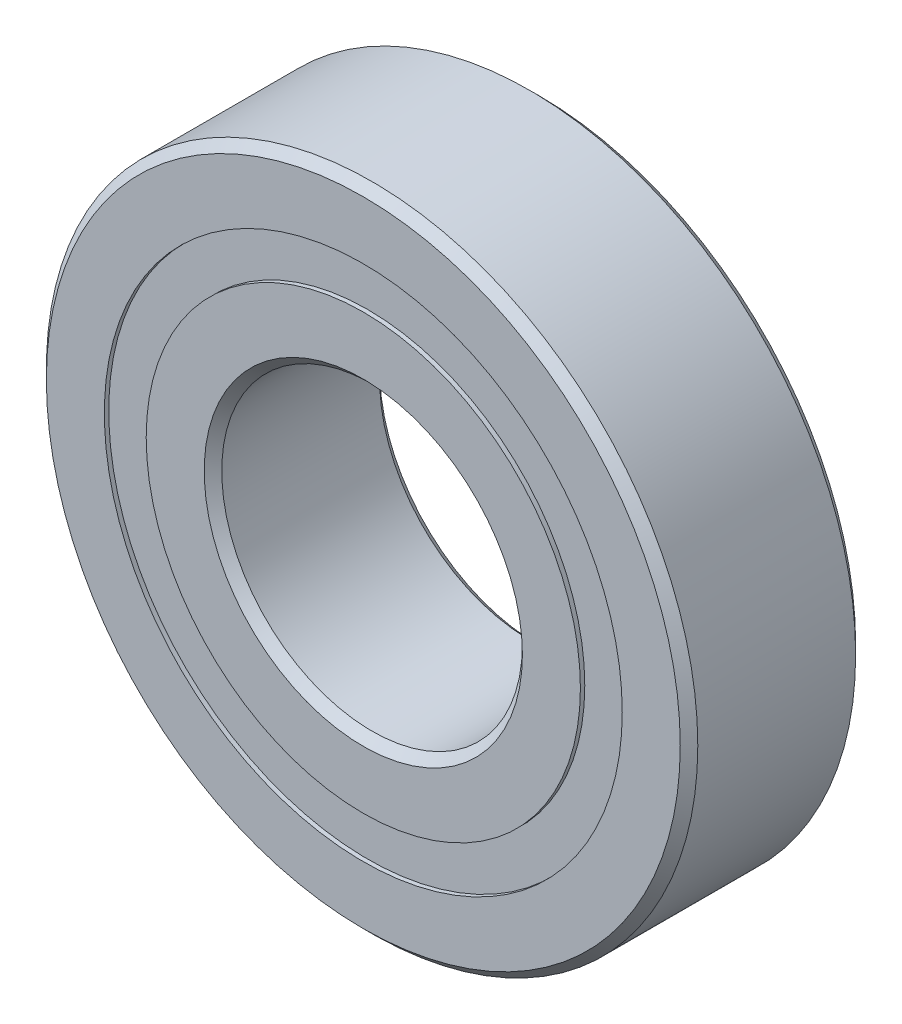
ISO-10303-21;
HEADER;
FILE_DESCRIPTION(('STEP AP214'),'2;1');
FILE_NAME('part.step','',(''),(''),'','','');
FILE_SCHEMA(('AUTOMOTIVE_DESIGN { 1 0 10303 214 1 1 1 1 }'));
ENDSEC;
DATA;
#1=APPLICATION_CONTEXT('core data for automotive mechanical design processes');
#2=APPLICATION_PROTOCOL_DEFINITION('international standard','automotive_design',2000,#1);
#3=PRODUCT_CONTEXT('',#1,'mechanical');
#4=PRODUCT('Part','Part','',(#3));
#5=PRODUCT_RELATED_PRODUCT_CATEGORY('part','',(#4));
#6=PRODUCT_DEFINITION_FORMATION('','',#4);
#7=PRODUCT_DEFINITION_CONTEXT('part definition',#1,'design');
#8=PRODUCT_DEFINITION('design','',#6,#7);
#9=PRODUCT_DEFINITION_SHAPE('','',#8);
#10=(LENGTH_UNIT() NAMED_UNIT(*) SI_UNIT(.MILLI.,.METRE.));
#11=(NAMED_UNIT(*) PLANE_ANGLE_UNIT() SI_UNIT($,.RADIAN.));
#12=(NAMED_UNIT(*) SI_UNIT($,.STERADIAN.) SOLID_ANGLE_UNIT());
#13=UNCERTAINTY_MEASURE_WITH_UNIT(LENGTH_MEASURE(1.E-05),#10,'distance_accuracy_value','');
#14=(GEOMETRIC_REPRESENTATION_CONTEXT(3) GLOBAL_UNCERTAINTY_ASSIGNED_CONTEXT((#13)) GLOBAL_UNIT_ASSIGNED_CONTEXT((#10,
#11,#12)) REPRESENTATION_CONTEXT('',''));
#15=CARTESIAN_POINT('',(0.,0.,0.));
#16=DIRECTION('',(0.,0.,1.));
#17=DIRECTION('',(1.,0.,0.));
#18=AXIS2_PLACEMENT_3D('',#15,#16,#17);
#19=CARTESIAN_POINT('',(0.,16.4070741758242,-5.2784375));
#20=DIRECTION('',(0.,0.,1.));
#21=DIRECTION('',(1.,0.,0.));
#22=AXIS2_PLACEMENT_3D('',#19,#20,#21);
#23=PLANE('',#22);
#24=CARTESIAN_POINT('',(0.,0.,-5.2784375));
#25=DIRECTION('',(0.,0.,1.));
#26=DIRECTION('',(1.,0.,0.));
#27=AXIS2_PLACEMENT_3D('',#24,#25,#26);
#28=CIRCLE('',#27,16.4070741758242);
#29=CARTESIAN_POINT('',(16.4070741758242,0.,-5.2784375));
#30=VERTEX_POINT('',#29);
#31=EDGE_CURVE('E55',#30,#30,#28,.T.);
#32=ORIENTED_EDGE('',*,*,#31,.F.);
#33=EDGE_LOOP('',(#32));
#34=FACE_BOUND('',#33,.T.);
#35=CARTESIAN_POINT('',(0.,0.,-5.2784375));
#36=DIRECTION('',(0.,0.,1.));
#37=DIRECTION('',(1.,0.,0.));
#38=AXIS2_PLACEMENT_3D('',#35,#36,#37);
#39=CIRCLE('',#38,13.7554258241758);
#40=CARTESIAN_POINT('',(13.7554258241758,0.,-5.2784375));
#41=VERTEX_POINT('',#40);
#42=EDGE_CURVE('E11',#41,#41,#39,.T.);
#43=ORIENTED_EDGE('',*,*,#42,.T.);
#44=EDGE_LOOP('',(#43));
#45=FACE_BOUND('',#44,.T.);
#46=ADVANCED_FACE('F41',(#34,#45),#23,.F.);
#47=CARTESIAN_POINT('',(0.,0.,5.55625));
#48=DIRECTION('',(0.,0.,1.));
#49=DIRECTION('',(1.,0.,0.));
#50=AXIS2_PLACEMENT_3D('',#47,#48,#49);
#51=CYLINDRICAL_SURFACE('',#50,13.7554258241758);
#52=ORIENTED_EDGE('',*,*,#42,.F.);
#53=EDGE_LOOP('',(#52));
#54=FACE_BOUND('',#53,.T.);
#55=CARTESIAN_POINT('',(0.,0.,-2.80284955168796));
#56=DIRECTION('',(0.,0.,1.));
#57=DIRECTION('',(1.,0.,0.));
#58=AXIS2_PLACEMENT_3D('',#55,#56,#57);
#59=CIRCLE('',#58,13.7554258241758);
#60=CARTESIAN_POINT('',(13.7554258241758,0.,-2.80284955168796));
#61=VERTEX_POINT('',#60);
#62=EDGE_CURVE('E47',#61,#61,#59,.T.);
#63=ORIENTED_EDGE('',*,*,#62,.T.);
#64=EDGE_LOOP('',(#63));
#65=FACE_BOUND('',#64,.T.);
#66=ADVANCED_FACE('F64',(#54,#65),#51,.F.);
#67=CARTESIAN_POINT('',(0.,16.4070741758242,-2.80284955168796));
#68=DIRECTION('',(0.,0.,-1.));
#69=DIRECTION('',(-1.,0.,0.));
#70=AXIS2_PLACEMENT_3D('',#67,#68,#69);
#71=PLANE('',#70);
#72=ORIENTED_EDGE('',*,*,#62,.F.);
#73=EDGE_LOOP('',(#72));
#74=FACE_BOUND('',#73,.T.);
#75=CARTESIAN_POINT('',(0.,0.,-2.80284955168796));
#76=DIRECTION('',(0.,0.,1.));
#77=DIRECTION('',(1.,0.,0.));
#78=AXIS2_PLACEMENT_3D('',#75,#76,#77);
#79=CIRCLE('',#78,16.4070741758242);
#80=CARTESIAN_POINT('',(16.4070741758242,0.,-2.80284955168796));
#81=VERTEX_POINT('',#80);
#82=EDGE_CURVE('E51',#81,#81,#79,.T.);
#83=ORIENTED_EDGE('',*,*,#82,.T.);
#84=EDGE_LOOP('',(#83));
#85=FACE_BOUND('',#84,.T.);
#86=ADVANCED_FACE('F68',(#74,#85),#71,.F.);
#87=CARTESIAN_POINT('',(0.,0.,5.55625));
#88=DIRECTION('',(0.,0.,1.));
#89=DIRECTION('',(1.,0.,0.));
#90=AXIS2_PLACEMENT_3D('',#87,#88,#89);
#91=CYLINDRICAL_SURFACE('',#90,16.4070741758242);
#92=ORIENTED_EDGE('',*,*,#82,.F.);
#93=EDGE_LOOP('',(#92));
#94=FACE_BOUND('',#93,.T.);
#95=ORIENTED_EDGE('',*,*,#31,.T.);
#96=EDGE_LOOP('',(#95));
#97=FACE_BOUND('',#96,.T.);
#98=ADVANCED_FACE('F61',(#94,#97),#91,.T.);
#99=CLOSED_SHELL('',(#46,#66,#86,#98));
#100=MANIFOLD_SOLID_BREP('B2',#99);
#101=CARTESIAN_POINT('',(0.,16.4070741758242,5.2784375));
#102=DIRECTION('',(0.,0.,-1.));
#103=DIRECTION('',(-1.,0.,0.));
#104=AXIS2_PLACEMENT_3D('',#101,#102,#103);
#105=PLANE('',#104);
#106=CARTESIAN_POINT('',(0.,0.,5.2784375));
#107=DIRECTION('',(0.,0.,1.));
#108=DIRECTION('',(1.,0.,0.));
#109=AXIS2_PLACEMENT_3D('',#106,#107,#108);
#110=CIRCLE('',#109,13.7554258241758);
#111=CARTESIAN_POINT('',(13.7554258241758,0.,5.2784375));
#112=VERTEX_POINT('',#111);
#113=EDGE_CURVE('E40',#112,#112,#110,.T.);
#114=ORIENTED_EDGE('',*,*,#113,.F.);
#115=EDGE_LOOP('',(#114));
#116=FACE_BOUND('',#115,.T.);
#117=CARTESIAN_POINT('',(0.,0.,5.2784375));
#118=DIRECTION('',(0.,0.,1.));
#119=DIRECTION('',(1.,0.,0.));
#120=AXIS2_PLACEMENT_3D('',#117,#118,#119);
#121=CIRCLE('',#120,16.4070741758242);
#122=CARTESIAN_POINT('',(16.4070741758242,0.,5.2784375));
#123=VERTEX_POINT('',#122);
#124=EDGE_CURVE('E122',#123,#123,#121,.T.);
#125=ORIENTED_EDGE('',*,*,#124,.T.);
#126=EDGE_LOOP('',(#125));
#127=FACE_BOUND('',#126,.T.);
#128=ADVANCED_FACE('F108',(#116,#127),#105,.F.);
#129=CARTESIAN_POINT('',(0.,0.,5.55625));
#130=DIRECTION('',(0.,0.,1.));
#131=DIRECTION('',(1.,0.,0.));
#132=AXIS2_PLACEMENT_3D('',#129,#130,#131);
#133=CYLINDRICAL_SURFACE('',#132,13.7554258241758);
#134=CARTESIAN_POINT('',(0.,0.,2.80284955168796));
#135=DIRECTION('',(0.,0.,1.));
#136=DIRECTION('',(1.,0.,0.));
#137=AXIS2_PLACEMENT_3D('',#134,#135,#136);
#138=CIRCLE('',#137,13.7554258241758);
#139=CARTESIAN_POINT('',(13.7554258241758,0.,2.80284955168796));
#140=VERTEX_POINT('',#139);
#141=EDGE_CURVE('E114',#140,#140,#138,.T.);
#142=ORIENTED_EDGE('',*,*,#141,.F.);
#143=EDGE_LOOP('',(#142));
#144=FACE_BOUND('',#143,.T.);
#145=ORIENTED_EDGE('',*,*,#113,.T.);
#146=EDGE_LOOP('',(#145));
#147=FACE_BOUND('',#146,.T.);
#148=ADVANCED_FACE('F137',(#144,#147),#133,.F.);
#149=CARTESIAN_POINT('',(0.,16.4070741758242,2.80284955168796));
#150=DIRECTION('',(0.,0.,1.));
#151=DIRECTION('',(1.,0.,0.));
#152=AXIS2_PLACEMENT_3D('',#149,#150,#151);
#153=PLANE('',#152);
#154=CARTESIAN_POINT('',(0.,0.,2.80284955168796));
#155=DIRECTION('',(0.,0.,1.));
#156=DIRECTION('',(1.,0.,0.));
#157=AXIS2_PLACEMENT_3D('',#154,#155,#156);
#158=CIRCLE('',#157,16.4070741758242);
#159=CARTESIAN_POINT('',(16.4070741758242,0.,2.80284955168796));
#160=VERTEX_POINT('',#159);
#161=EDGE_CURVE('E118',#160,#160,#158,.T.);
#162=ORIENTED_EDGE('',*,*,#161,.F.);
#163=EDGE_LOOP('',(#162));
#164=FACE_BOUND('',#163,.T.);
#165=ORIENTED_EDGE('',*,*,#141,.T.);
#166=EDGE_LOOP('',(#165));
#167=FACE_BOUND('',#166,.T.);
#168=ADVANCED_FACE('F132',(#164,#167),#153,.F.);
#169=CARTESIAN_POINT('',(0.,0.,5.55625));
#170=DIRECTION('',(0.,0.,1.));
#171=DIRECTION('',(1.,0.,0.));
#172=AXIS2_PLACEMENT_3D('',#169,#170,#171);
#173=CYLINDRICAL_SURFACE('',#172,16.4070741758242);
#174=ORIENTED_EDGE('',*,*,#124,.F.);
#175=EDGE_LOOP('',(#174));
#176=FACE_BOUND('',#175,.T.);
#177=ORIENTED_EDGE('',*,*,#161,.T.);
#178=EDGE_LOOP('',(#177));
#179=FACE_BOUND('',#178,.T.);
#180=ADVANCED_FACE('F129',(#176,#179),#173,.T.);
#181=CLOSED_SHELL('',(#128,#148,#168,#180));
#182=MANIFOLD_SOLID_BREP('B6',#181);
#183=CARTESIAN_POINT('',(-7.54062499999983,13.0607456208242,0.));
#184=DIRECTION('',(0.,0.,1.));
#185=DIRECTION('',(-0.499999999999989,0.866025403784445,0.));
#186=AXIS2_PLACEMENT_3D('',#183,#184,#185);
#187=SPHERICAL_SURFACE('',#186,2.80284955168796);
#188=CARTESIAN_POINT('',(-7.54062499999983,13.0607456208242,2.80284955168796));
#189=VERTEX_POINT('',#188);
#190=VERTEX_LOOP('',#189);
#191=FACE_BOUND('',#190,.T.);
#192=ADVANCED_FACE('F175',(#191),#187,.T.);
#193=CLOSED_SHELL('',(#192));
#194=MANIFOLD_SOLID_BREP('B35',#193);
#195=CARTESIAN_POINT('',(-13.060745620824,7.54062500000015,0.));
#196=DIRECTION('',(0.,0.,1.));
#197=DIRECTION('',(-0.866025403784433,0.50000000000001,0.));
#198=AXIS2_PLACEMENT_3D('',#195,#196,#197);
#199=SPHERICAL_SURFACE('',#198,2.80284955168796);
#200=CARTESIAN_POINT('',(-13.060745620824,7.54062500000015,2.80284955168796));
#201=VERTEX_POINT('',#200);
#202=VERTEX_LOOP('',#201);
#203=FACE_BOUND('',#202,.T.);
#204=ADVANCED_FACE('F195',(#203),#199,.T.);
#205=CLOSED_SHELL('',(#204));
#206=MANIFOLD_SOLID_BREP('B104',#205);
#207=CARTESIAN_POINT('',(-15.08125,1.57967708824284E-13,0.));
#208=DIRECTION('',(0.,0.,1.));
#209=DIRECTION('',(-1.,0.,0.));
#210=AXIS2_PLACEMENT_3D('',#207,#208,#209);
#211=SPHERICAL_SURFACE('',#210,2.80284955168796);
#212=CARTESIAN_POINT('',(-15.08125,1.57967708824284E-13,2.80284955168796));
#213=VERTEX_POINT('',#212);
#214=VERTEX_LOOP('',#213);
#215=FACE_BOUND('',#214,.T.);
#216=ADVANCED_FACE('F215',(#215),#211,.T.);
#217=CLOSED_SHELL('',(#216));
#218=MANIFOLD_SOLID_BREP('B171',#217);
#219=CARTESIAN_POINT('',(-13.0607456208241,-7.54062499999988,0.));
#220=DIRECTION('',(0.,0.,1.));
#221=DIRECTION('',(-0.866025403784443,-0.499999999999992,0.));
#222=AXIS2_PLACEMENT_3D('',#219,#220,#221);
#223=SPHERICAL_SURFACE('',#222,2.80284955168796);
#224=CARTESIAN_POINT('',(-13.0607456208241,-7.54062499999988,2.80284955168796));
#225=VERTEX_POINT('',#224);
#226=VERTEX_LOOP('',#225);
#227=FACE_BOUND('',#226,.T.);
#228=ADVANCED_FACE('F235',(#227),#223,.T.);
#229=CLOSED_SHELL('',(#228));
#230=MANIFOLD_SOLID_BREP('B191',#229);
#231=CARTESIAN_POINT('',(-7.54062500000011,-13.060745620824,0.));
#232=DIRECTION('',(0.,0.,1.));
#233=DIRECTION('',(-0.500000000000007,-0.866025403784435,0.));
#234=AXIS2_PLACEMENT_3D('',#231,#232,#233);
#235=SPHERICAL_SURFACE('',#234,2.80284955168796);
#236=CARTESIAN_POINT('',(-7.54062500000011,-13.060745620824,2.80284955168796));
#237=VERTEX_POINT('',#236);
#238=VERTEX_LOOP('',#237);
#239=FACE_BOUND('',#238,.T.);
#240=ADVANCED_FACE('F255',(#239),#235,.T.);
#241=CLOSED_SHELL('',(#240));
#242=MANIFOLD_SOLID_BREP('B211',#241);
#243=CARTESIAN_POINT('',(-1.05311805882856E-13,-15.08125,0.));
#244=DIRECTION('',(0.,0.,1.));
#245=DIRECTION('',(0.,-1.,0.));
#246=AXIS2_PLACEMENT_3D('',#243,#244,#245);
#247=SPHERICAL_SURFACE('',#246,2.80284955168796);
#248=CARTESIAN_POINT('',(-1.05311805882856E-13,-15.08125,2.80284955168796));
#249=VERTEX_POINT('',#248);
#250=VERTEX_LOOP('',#249);
#251=FACE_BOUND('',#250,.T.);
#252=ADVANCED_FACE('F275',(#251),#247,.T.);
#253=CLOSED_SHELL('',(#252));
#254=MANIFOLD_SOLID_BREP('B231',#253);
#255=CARTESIAN_POINT('',(7.54062499999992,-13.0607456208241,0.));
#256=DIRECTION('',(0.,0.,1.));
#257=DIRECTION('',(0.499999999999995,-0.866025403784442,0.));
#258=AXIS2_PLACEMENT_3D('',#255,#256,#257);
#259=SPHERICAL_SURFACE('',#258,2.80284955168796);
#260=CARTESIAN_POINT('',(7.54062499999992,-13.0607456208241,2.80284955168796));
#261=VERTEX_POINT('',#260);
#262=VERTEX_LOOP('',#261);
#263=FACE_BOUND('',#262,.T.);
#264=ADVANCED_FACE('F295',(#263),#259,.T.);
#265=CLOSED_SHELL('',(#264));
#266=MANIFOLD_SOLID_BREP('B251',#265);
#267=CARTESIAN_POINT('',(13.060745620824,-7.54062500000006,0.));
#268=DIRECTION('',(0.,0.,1.));
#269=DIRECTION('',(0.866025403784436,-0.500000000000004,0.));
#270=AXIS2_PLACEMENT_3D('',#267,#268,#269);
#271=SPHERICAL_SURFACE('',#270,2.80284955168796);
#272=CARTESIAN_POINT('',(13.060745620824,-7.54062500000006,2.80284955168796));
#273=VERTEX_POINT('',#272);
#274=VERTEX_LOOP('',#273);
#275=FACE_BOUND('',#274,.T.);
#276=ADVANCED_FACE('F315',(#275),#271,.T.);
#277=CLOSED_SHELL('',(#276));
#278=MANIFOLD_SOLID_BREP('B271',#277);
#279=CARTESIAN_POINT('',(15.08125,0.,0.));
#280=DIRECTION('',(0.,0.,1.));
#281=DIRECTION('',(1.,0.,0.));
#282=AXIS2_PLACEMENT_3D('',#279,#280,#281);
#283=SPHERICAL_SURFACE('',#282,2.80284955168796);
#284=CARTESIAN_POINT('',(15.08125,0.,2.80284955168796));
#285=VERTEX_POINT('',#284);
#286=VERTEX_LOOP('',#285);
#287=FACE_BOUND('',#286,.T.);
#288=ADVANCED_FACE('F335',(#287),#283,.T.);
#289=CLOSED_SHELL('',(#288));
#290=MANIFOLD_SOLID_BREP('B291',#289);
#291=CARTESIAN_POINT('',(13.0607456208241,7.54062499999997,0.));
#292=DIRECTION('',(0.,0.,1.));
#293=DIRECTION('',(0.86602540378444,0.499999999999998,0.));
#294=AXIS2_PLACEMENT_3D('',#291,#292,#293);
#295=SPHERICAL_SURFACE('',#294,2.80284955168796);
#296=CARTESIAN_POINT('',(13.0607456208241,7.54062499999997,2.80284955168796));
#297=VERTEX_POINT('',#296);
#298=VERTEX_LOOP('',#297);
#299=FACE_BOUND('',#298,.T.);
#300=ADVANCED_FACE('F355',(#299),#295,.T.);
#301=CLOSED_SHELL('',(#300));
#302=MANIFOLD_SOLID_BREP('B311',#301);
#303=CARTESIAN_POINT('',(7.54062500000002,13.0607456208241,0.));
#304=DIRECTION('',(0.,0.,1.));
#305=DIRECTION('',(0.500000000000001,0.866025403784438,0.));
#306=AXIS2_PLACEMENT_3D('',#303,#304,#305);
#307=SPHERICAL_SURFACE('',#306,2.80284955168796);
#308=CARTESIAN_POINT('',(7.54062500000002,13.0607456208241,2.80284955168796));
#309=VERTEX_POINT('',#308);
#310=VERTEX_LOOP('',#309);
#311=FACE_BOUND('',#310,.T.);
#312=ADVANCED_FACE('F375',(#311),#307,.T.);
#313=CLOSED_SHELL('',(#312));
#314=MANIFOLD_SOLID_BREP('B331',#313);
#315=CARTESIAN_POINT('',(0.,15.08125,0.));
#316=DIRECTION('',(0.,0.,1.));
#317=DIRECTION('',(0.,1.,0.));
#318=AXIS2_PLACEMENT_3D('',#315,#316,#317);
#319=SPHERICAL_SURFACE('',#318,2.80284955168796);
#320=CARTESIAN_POINT('',(0.,15.08125,2.80284955168796));
#321=VERTEX_POINT('',#320);
#322=VERTEX_LOOP('',#321);
#323=FACE_BOUND('',#322,.T.);
#324=ADVANCED_FACE('F397',(#323),#319,.T.);
#325=CLOSED_SHELL('',(#324));
#326=MANIFOLD_SOLID_BREP('B351',#325);
#327=CARTESIAN_POINT('',(0.,13.7554258241758,5.55625));
#328=DIRECTION('',(0.,0.,-1.));
#329=DIRECTION('',(-1.,0.,0.));
#330=AXIS2_PLACEMENT_3D('',#327,#328,#329);
#331=PLANE('',#330);
#332=CARTESIAN_POINT('',(0.,0.,5.55625));
#333=DIRECTION('',(0.,0.,1.));
#334=DIRECTION('',(1.,0.,0.));
#335=AXIS2_PLACEMENT_3D('',#332,#333,#334);
#336=CIRCLE('',#335,10.080625);
#337=CARTESIAN_POINT('',(10.080625,0.,5.55625));
#338=VERTEX_POINT('',#337);
#339=EDGE_CURVE('E444',#338,#338,#336,.T.);
#340=ORIENTED_EDGE('',*,*,#339,.F.);
#341=EDGE_LOOP('',(#340));
#342=FACE_BOUND('',#341,.T.);
#343=CARTESIAN_POINT('',(0.,0.,5.55625));
#344=DIRECTION('',(0.,0.,1.));
#345=DIRECTION('',(1.,0.,0.));
#346=AXIS2_PLACEMENT_3D('',#343,#344,#345);
#347=CIRCLE('',#346,13.7554258241758);
#348=CARTESIAN_POINT('',(13.7554258241758,0.,5.55625));
#349=VERTEX_POINT('',#348);
#350=EDGE_CURVE('E396',#349,#349,#347,.T.);
#351=ORIENTED_EDGE('',*,*,#350,.T.);
#352=EDGE_LOOP('',(#351));
#353=FACE_BOUND('',#352,.T.);
#354=ADVANCED_FACE('F416',(#342,#353),#331,.F.);
#355=CARTESIAN_POINT('',(0.,0.,5.55625));
#356=DIRECTION('',(0.,0.,1.));
#357=DIRECTION('',(1.,0.,0.));
#358=AXIS2_PLACEMENT_3D('',#355,#356,#357);
#359=CYLINDRICAL_SURFACE('',#358,13.7554258241758);
#360=ORIENTED_EDGE('',*,*,#350,.F.);
#361=EDGE_LOOP('',(#360));
#362=FACE_BOUND('',#361,.T.);
#363=CARTESIAN_POINT('',(0.,0.,2.46944444444444));
#364=DIRECTION('',(0.,0.,1.));
#365=DIRECTION('',(1.,0.,0.));
#366=AXIS2_PLACEMENT_3D('',#363,#364,#365);
#367=CIRCLE('',#366,13.7554258241758);
#368=CARTESIAN_POINT('',(13.7554258241758,0.,2.46944444444444));
#369=VERTEX_POINT('',#368);
#370=EDGE_CURVE('E422',#369,#369,#367,.T.);
#371=ORIENTED_EDGE('',*,*,#370,.T.);
#372=EDGE_LOOP('',(#371));
#373=FACE_BOUND('',#372,.T.);
#374=ADVANCED_FACE('F451',(#362,#373),#359,.T.);
#375=CARTESIAN_POINT('',(0.,0.,0.));
#376=DIRECTION('',(0.,0.,1.));
#377=DIRECTION('',(1.,0.,0.));
#378=AXIS2_PLACEMENT_3D('',#375,#376,#377);
#379=TOROIDAL_SURFACE('',#378,15.08125,2.80284955168795);
#380=ORIENTED_EDGE('',*,*,#370,.F.);
#381=EDGE_LOOP('',(#380));
#382=FACE_BOUND('',#381,.T.);
#383=CARTESIAN_POINT('',(0.,0.,-2.46944444444445));
#384=DIRECTION('',(0.,0.,1.));
#385=DIRECTION('',(1.,0.,0.));
#386=AXIS2_PLACEMENT_3D('',#383,#384,#385);
#387=CIRCLE('',#386,13.7554258241758);
#388=CARTESIAN_POINT('',(13.7554258241758,0.,-2.46944444444445));
#389=VERTEX_POINT('',#388);
#390=EDGE_CURVE('E426',#389,#389,#387,.T.);
#391=ORIENTED_EDGE('',*,*,#390,.T.);
#392=EDGE_LOOP('',(#391));
#393=FACE_BOUND('',#392,.T.);
#394=ADVANCED_FACE('F455',(#382,#393),#379,.F.);
#395=CARTESIAN_POINT('',(0.,0.,5.55625));
#396=DIRECTION('',(0.,0.,1.));
#397=DIRECTION('',(1.,0.,0.));
#398=AXIS2_PLACEMENT_3D('',#395,#396,#397);
#399=CYLINDRICAL_SURFACE('',#398,13.7554258241758);
#400=ORIENTED_EDGE('',*,*,#390,.F.);
#401=EDGE_LOOP('',(#400));
#402=FACE_BOUND('',#401,.T.);
#403=CARTESIAN_POINT('',(0.,0.,-5.55625));
#404=DIRECTION('',(0.,0.,1.));
#405=DIRECTION('',(1.,0.,0.));
#406=AXIS2_PLACEMENT_3D('',#403,#404,#405);
#407=CIRCLE('',#406,13.7554258241758);
#408=CARTESIAN_POINT('',(13.7554258241758,0.,-5.55625));
#409=VERTEX_POINT('',#408);
#410=EDGE_CURVE('E430',#409,#409,#407,.T.);
#411=ORIENTED_EDGE('',*,*,#410,.T.);
#412=EDGE_LOOP('',(#411));
#413=FACE_BOUND('',#412,.T.);
#414=ADVANCED_FACE('F460',(#402,#413),#399,.T.);
#415=CARTESIAN_POINT('',(0.,10.080625,-5.55625));
#416=DIRECTION('',(0.,0.,1.));
#417=DIRECTION('',(1.,0.,0.));
#418=AXIS2_PLACEMENT_3D('',#415,#416,#417);
#419=PLANE('',#418);
#420=ORIENTED_EDGE('',*,*,#410,.F.);
#421=EDGE_LOOP('',(#420));
#422=FACE_BOUND('',#421,.T.);
#423=CARTESIAN_POINT('',(0.,0.,-5.55625));
#424=DIRECTION('',(0.,0.,1.));
#425=DIRECTION('',(1.,0.,0.));
#426=AXIS2_PLACEMENT_3D('',#423,#424,#425);
#427=CIRCLE('',#426,10.080625);
#428=CARTESIAN_POINT('',(10.080625,0.,-5.55625));
#429=VERTEX_POINT('',#428);
#430=EDGE_CURVE('E435',#429,#429,#427,.T.);
#431=ORIENTED_EDGE('',*,*,#430,.T.);
#432=EDGE_LOOP('',(#431));
#433=FACE_BOUND('',#432,.T.);
#434=ADVANCED_FACE('F466',(#422,#433),#419,.F.);
#435=CARTESIAN_POINT('',(0.,0.,-5.000625));
#436=DIRECTION('',(0.,0.,-1.));
#437=DIRECTION('',(-1.,0.,0.));
#438=AXIS2_PLACEMENT_3D('',#435,#436,#437);
#439=CONICAL_SURFACE('',#438,9.525,0.78539816339745);
#440=ORIENTED_EDGE('',*,*,#430,.F.);
#441=EDGE_LOOP('',(#440));
#442=FACE_BOUND('',#441,.T.);
#443=CARTESIAN_POINT('',(0.,0.,-5.000625));
#444=DIRECTION('',(0.,0.,1.));
#445=DIRECTION('',(1.,0.,0.));
#446=AXIS2_PLACEMENT_3D('',#443,#444,#445);
#447=CIRCLE('',#446,9.525);
#448=CARTESIAN_POINT('',(9.525,0.,-5.000625));
#449=VERTEX_POINT('',#448);
#450=EDGE_CURVE('E438',#449,#449,#447,.T.);
#451=ORIENTED_EDGE('',*,*,#450,.T.);
#452=EDGE_LOOP('',(#451));
#453=FACE_BOUND('',#452,.T.);
#454=ADVANCED_FACE('F470',(#442,#453),#439,.F.);
#455=CARTESIAN_POINT('',(0.,0.,5.55625));
#456=DIRECTION('',(0.,0.,1.));
#457=DIRECTION('',(1.,0.,0.));
#458=AXIS2_PLACEMENT_3D('',#455,#456,#457);
#459=CYLINDRICAL_SURFACE('',#458,9.525);
#460=ORIENTED_EDGE('',*,*,#450,.F.);
#461=EDGE_LOOP('',(#460));
#462=FACE_BOUND('',#461,.T.);
#463=CARTESIAN_POINT('',(0.,0.,5.000625));
#464=DIRECTION('',(0.,0.,1.));
#465=DIRECTION('',(1.,0.,0.));
#466=AXIS2_PLACEMENT_3D('',#463,#464,#465);
#467=CIRCLE('',#466,9.525);
#468=CARTESIAN_POINT('',(9.525,0.,5.000625));
#469=VERTEX_POINT('',#468);
#470=EDGE_CURVE('E441',#469,#469,#467,.T.);
#471=ORIENTED_EDGE('',*,*,#470,.T.);
#472=EDGE_LOOP('',(#471));
#473=FACE_BOUND('',#472,.T.);
#474=ADVANCED_FACE('F474',(#462,#473),#459,.F.);
#475=CARTESIAN_POINT('',(0.,0.,5.55625));
#476=DIRECTION('',(0.,0.,1.));
#477=DIRECTION('',(1.,0.,0.));
#478=AXIS2_PLACEMENT_3D('',#475,#476,#477);
#479=CONICAL_SURFACE('',#478,10.080625,0.785398163397448);
#480=ORIENTED_EDGE('',*,*,#470,.F.);
#481=EDGE_LOOP('',(#480));
#482=FACE_BOUND('',#481,.T.);
#483=ORIENTED_EDGE('',*,*,#339,.T.);
#484=EDGE_LOOP('',(#483));
#485=FACE_BOUND('',#484,.T.);
#486=ADVANCED_FACE('F448',(#482,#485),#479,.F.);
#487=CLOSED_SHELL('',(#354,#374,#394,#414,#434,#454,#474,#486));
#488=MANIFOLD_SOLID_BREP('B371',#487);
#489=CARTESIAN_POINT('',(0.,0.,5.000625));
#490=DIRECTION('',(0.,0.,-1.));
#491=DIRECTION('',(-1.,0.,0.));
#492=AXIS2_PLACEMENT_3D('',#489,#490,#491);
#493=CONICAL_SURFACE('',#492,20.6375,0.785398163397446);
#494=CARTESIAN_POINT('',(0.,0.,5.55625));
#495=DIRECTION('',(0.,0.,1.));
#496=DIRECTION('',(1.,0.,0.));
#497=AXIS2_PLACEMENT_3D('',#494,#495,#496);
#498=CIRCLE('',#497,20.081875);
#499=CARTESIAN_POINT('',(20.081875,0.,5.55625));
#500=VERTEX_POINT('',#499);
#501=EDGE_CURVE('E565',#500,#500,#498,.T.);
#502=ORIENTED_EDGE('',*,*,#501,.F.);
#503=EDGE_LOOP('',(#502));
#504=FACE_BOUND('',#503,.T.);
#505=CARTESIAN_POINT('',(0.,0.,5.000625));
#506=DIRECTION('',(0.,0.,1.));
#507=DIRECTION('',(1.,0.,0.));
#508=AXIS2_PLACEMENT_3D('',#505,#506,#507);
#509=CIRCLE('',#508,20.6375);
#510=CARTESIAN_POINT('',(20.6375,0.,5.000625));
#511=VERTEX_POINT('',#510);
#512=EDGE_CURVE('E415',#511,#511,#509,.T.);
#513=ORIENTED_EDGE('',*,*,#512,.T.);
#514=EDGE_LOOP('',(#513));
#515=FACE_BOUND('',#514,.T.);
#516=ADVANCED_FACE('F537',(#504,#515),#493,.T.);
#517=CARTESIAN_POINT('',(0.,0.,5.55625));
#518=DIRECTION('',(0.,0.,1.));
#519=DIRECTION('',(1.,0.,0.));
#520=AXIS2_PLACEMENT_3D('',#517,#518,#519);
#521=CYLINDRICAL_SURFACE('',#520,20.6375);
#522=ORIENTED_EDGE('',*,*,#512,.F.);
#523=EDGE_LOOP('',(#522));
#524=FACE_BOUND('',#523,.T.);
#525=CARTESIAN_POINT('',(0.,0.,-5.000625));
#526=DIRECTION('',(0.,0.,1.));
#527=DIRECTION('',(1.,0.,0.));
#528=AXIS2_PLACEMENT_3D('',#525,#526,#527);
#529=CIRCLE('',#528,20.6375);
#530=CARTESIAN_POINT('',(20.6375,0.,-5.000625));
#531=VERTEX_POINT('',#530);
#532=EDGE_CURVE('E543',#531,#531,#529,.T.);
#533=ORIENTED_EDGE('',*,*,#532,.T.);
#534=EDGE_LOOP('',(#533));
#535=FACE_BOUND('',#534,.T.);
#536=ADVANCED_FACE('F572',(#524,#535),#521,.T.);
#537=CARTESIAN_POINT('',(0.,0.,-5.55625));
#538=DIRECTION('',(0.,0.,1.));
#539=DIRECTION('',(1.,0.,0.));
#540=AXIS2_PLACEMENT_3D('',#537,#538,#539);
#541=CONICAL_SURFACE('',#540,20.081875,0.785398163397447);
#542=ORIENTED_EDGE('',*,*,#532,.F.);
#543=EDGE_LOOP('',(#542));
#544=FACE_BOUND('',#543,.T.);
#545=CARTESIAN_POINT('',(0.,0.,-5.55625));
#546=DIRECTION('',(0.,0.,1.));
#547=DIRECTION('',(1.,0.,0.));
#548=AXIS2_PLACEMENT_3D('',#545,#546,#547);
#549=CIRCLE('',#548,20.081875);
#550=CARTESIAN_POINT('',(20.081875,0.,-5.55625));
#551=VERTEX_POINT('',#550);
#552=EDGE_CURVE('E547',#551,#551,#549,.T.);
#553=ORIENTED_EDGE('',*,*,#552,.T.);
#554=EDGE_LOOP('',(#553));
#555=FACE_BOUND('',#554,.T.);
#556=ADVANCED_FACE('F576',(#544,#555),#541,.T.);
#557=CARTESIAN_POINT('',(0.,20.081875,-5.55625));
#558=DIRECTION('',(0.,0.,1.));
#559=DIRECTION('',(1.,0.,0.));
#560=AXIS2_PLACEMENT_3D('',#557,#558,#559);
#561=PLANE('',#560);
#562=ORIENTED_EDGE('',*,*,#552,.F.);
#563=EDGE_LOOP('',(#562));
#564=FACE_BOUND('',#563,.T.);
#565=CARTESIAN_POINT('',(0.,0.,-5.55625));
#566=DIRECTION('',(0.,0.,1.));
#567=DIRECTION('',(1.,0.,0.));
#568=AXIS2_PLACEMENT_3D('',#565,#566,#567);
#569=CIRCLE('',#568,16.4070741758242);
#570=CARTESIAN_POINT('',(16.4070741758242,0.,-5.55625));
#571=VERTEX_POINT('',#570);
#572=EDGE_CURVE('E551',#571,#571,#569,.T.);
#573=ORIENTED_EDGE('',*,*,#572,.T.);
#574=EDGE_LOOP('',(#573));
#575=FACE_BOUND('',#574,.T.);
#576=ADVANCED_FACE('F581',(#564,#575),#561,.F.);
#577=CARTESIAN_POINT('',(0.,0.,5.55625));
#578=DIRECTION('',(0.,0.,1.));
#579=DIRECTION('',(1.,0.,0.));
#580=AXIS2_PLACEMENT_3D('',#577,#578,#579);
#581=CYLINDRICAL_SURFACE('',#580,16.4070741758242);
#582=ORIENTED_EDGE('',*,*,#572,.F.);
#583=EDGE_LOOP('',(#582));
#584=FACE_BOUND('',#583,.T.);
#585=CARTESIAN_POINT('',(0.,0.,-2.46944444444444));
#586=DIRECTION('',(0.,0.,1.));
#587=DIRECTION('',(1.,0.,0.));
#588=AXIS2_PLACEMENT_3D('',#585,#586,#587);
#589=CIRCLE('',#588,16.4070741758242);
#590=CARTESIAN_POINT('',(16.4070741758242,0.,-2.46944444444444));
#591=VERTEX_POINT('',#590);
#592=EDGE_CURVE('E556',#591,#591,#589,.T.);
#593=ORIENTED_EDGE('',*,*,#592,.T.);
#594=EDGE_LOOP('',(#593));
#595=FACE_BOUND('',#594,.T.);
#596=ADVANCED_FACE('F587',(#584,#595),#581,.F.);
#597=CARTESIAN_POINT('',(0.,0.,0.));
#598=DIRECTION('',(0.,0.,1.));
#599=DIRECTION('',(1.,0.,0.));
#600=AXIS2_PLACEMENT_3D('',#597,#598,#599);
#601=TOROIDAL_SURFACE('',#600,15.08125,2.80284955168796);
#602=ORIENTED_EDGE('',*,*,#592,.F.);
#603=EDGE_LOOP('',(#602));
#604=FACE_BOUND('',#603,.T.);
#605=CARTESIAN_POINT('',(0.,0.,2.46944444444444));
#606=DIRECTION('',(0.,0.,1.));
#607=DIRECTION('',(1.,0.,0.));
#608=AXIS2_PLACEMENT_3D('',#605,#606,#607);
#609=CIRCLE('',#608,16.4070741758242);
#610=CARTESIAN_POINT('',(16.4070741758242,0.,2.46944444444444));
#611=VERTEX_POINT('',#610);
#612=EDGE_CURVE('E559',#611,#611,#609,.T.);
#613=ORIENTED_EDGE('',*,*,#612,.T.);
#614=EDGE_LOOP('',(#613));
#615=FACE_BOUND('',#614,.T.);
#616=ADVANCED_FACE('F591',(#604,#615),#601,.F.);
#617=CARTESIAN_POINT('',(0.,0.,5.55625));
#618=DIRECTION('',(0.,0.,1.));
#619=DIRECTION('',(1.,0.,0.));
#620=AXIS2_PLACEMENT_3D('',#617,#618,#619);
#621=CYLINDRICAL_SURFACE('',#620,16.4070741758242);
#622=ORIENTED_EDGE('',*,*,#612,.F.);
#623=EDGE_LOOP('',(#622));
#624=FACE_BOUND('',#623,.T.);
#625=CARTESIAN_POINT('',(0.,0.,5.55625));
#626=DIRECTION('',(0.,0.,1.));
#627=DIRECTION('',(1.,0.,0.));
#628=AXIS2_PLACEMENT_3D('',#625,#626,#627);
#629=CIRCLE('',#628,16.4070741758242);
#630=CARTESIAN_POINT('',(16.4070741758242,0.,5.55625));
#631=VERTEX_POINT('',#630);
#632=EDGE_CURVE('E562',#631,#631,#629,.T.);
#633=ORIENTED_EDGE('',*,*,#632,.T.);
#634=EDGE_LOOP('',(#633));
#635=FACE_BOUND('',#634,.T.);
#636=ADVANCED_FACE('F595',(#624,#635),#621,.F.);
#637=CARTESIAN_POINT('',(0.,20.081875,5.55625));
#638=DIRECTION('',(0.,0.,-1.));
#639=DIRECTION('',(-1.,0.,0.));
#640=AXIS2_PLACEMENT_3D('',#637,#638,#639);
#641=PLANE('',#640);
#642=ORIENTED_EDGE('',*,*,#632,.F.);
#643=EDGE_LOOP('',(#642));
#644=FACE_BOUND('',#643,.T.);
#645=ORIENTED_EDGE('',*,*,#501,.T.);
#646=EDGE_LOOP('',(#645));
#647=FACE_BOUND('',#646,.T.);
#648=ADVANCED_FACE('F569',(#644,#647),#641,.F.);
#649=CLOSED_SHELL('',(#516,#536,#556,#576,#596,#616,#636,#648));
#650=MANIFOLD_SOLID_BREP('B391',#649);
#651=ADVANCED_BREP_SHAPE_REPRESENTATION('',(#18,#100,#182,#194,#206,#218,#230,#242,#254,#266,
#278,#290,#302,#314,#326,#488,#650),#14);
#652=SHAPE_DEFINITION_REPRESENTATION(#9,#651);
ENDSEC;
END-ISO-10303-21;
